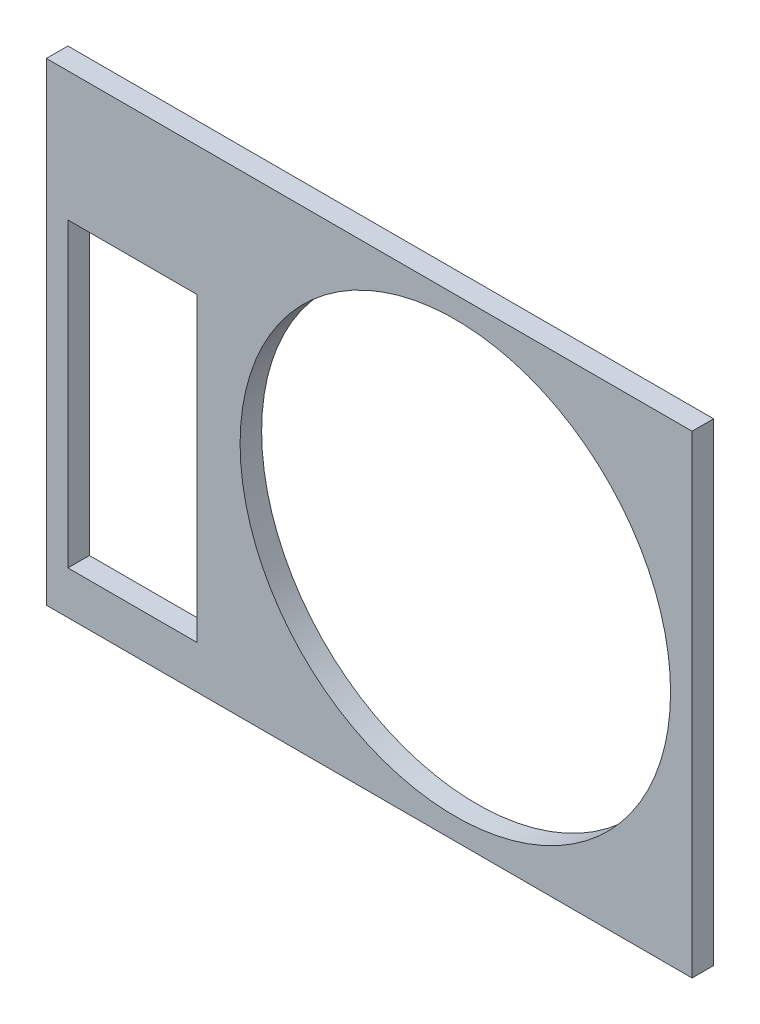
ISO-10303-21;
HEADER;
FILE_DESCRIPTION(('STEP AP214'),'2;1');
FILE_NAME('part.step','',(''),(''),'','','');
FILE_SCHEMA(('AUTOMOTIVE_DESIGN { 1 0 10303 214 1 1 1 1 }'));
ENDSEC;
DATA;
#1=APPLICATION_CONTEXT('core data for automotive mechanical design processes');
#2=APPLICATION_PROTOCOL_DEFINITION('international standard','automotive_design',2000,#1);
#3=PRODUCT_CONTEXT('',#1,'mechanical');
#4=PRODUCT('Part','Part','',(#3));
#5=PRODUCT_RELATED_PRODUCT_CATEGORY('part','',(#4));
#6=PRODUCT_DEFINITION_FORMATION('','',#4);
#7=PRODUCT_DEFINITION_CONTEXT('part definition',#1,'design');
#8=PRODUCT_DEFINITION('design','',#6,#7);
#9=PRODUCT_DEFINITION_SHAPE('','',#8);
#10=(LENGTH_UNIT() NAMED_UNIT(*) SI_UNIT(.MILLI.,.METRE.));
#11=(NAMED_UNIT(*) PLANE_ANGLE_UNIT() SI_UNIT($,.RADIAN.));
#12=(NAMED_UNIT(*) SI_UNIT($,.STERADIAN.) SOLID_ANGLE_UNIT());
#13=UNCERTAINTY_MEASURE_WITH_UNIT(LENGTH_MEASURE(1.E-05),#10,'distance_accuracy_value','');
#14=(GEOMETRIC_REPRESENTATION_CONTEXT(3) GLOBAL_UNCERTAINTY_ASSIGNED_CONTEXT((#13)) GLOBAL_UNIT_ASSIGNED_CONTEXT((#10,
#11,#12)) REPRESENTATION_CONTEXT('',''));
#15=CARTESIAN_POINT('',(0.,0.,0.));
#16=DIRECTION('',(0.,0.,1.));
#17=DIRECTION('',(1.,0.,0.));
#18=AXIS2_PLACEMENT_3D('',#15,#16,#17);
#19=CARTESIAN_POINT('',(0.,0.,10.));
#20=DIRECTION('',(0.,0.,-1.));
#21=DIRECTION('',(-1.,0.,0.));
#22=AXIS2_PLACEMENT_3D('',#19,#20,#21);
#23=PLANE('',#22);
#24=DIRECTION('',(-1.,0.,0.));
#25=VECTOR('',#24,1.);
#26=CARTESIAN_POINT('',(70.,160.,10.));
#27=LINE('',#26,#25);
#28=CARTESIAN_POINT('',(70.,160.,10.));
#29=VERTEX_POINT('',#28);
#30=CARTESIAN_POINT('',(10.,160.,10.));
#31=VERTEX_POINT('',#30);
#32=EDGE_CURVE('E136',#29,#31,#27,.T.);
#33=ORIENTED_EDGE('',*,*,#32,.F.);
#34=DIRECTION('',(0.,1.,0.));
#35=VECTOR('',#34,1.);
#36=CARTESIAN_POINT('',(70.,20.,10.));
#37=LINE('',#36,#35);
#38=CARTESIAN_POINT('',(70.,20.,10.));
#39=VERTEX_POINT('',#38);
#40=EDGE_CURVE('E59',#39,#29,#37,.T.);
#41=ORIENTED_EDGE('',*,*,#40,.F.);
#42=DIRECTION('',(1.,0.,0.));
#43=VECTOR('',#42,1.);
#44=CARTESIAN_POINT('',(70.,20.,10.));
#45=LINE('',#44,#43);
#46=CARTESIAN_POINT('',(10.,20.,10.));
#47=VERTEX_POINT('',#46);
#48=EDGE_CURVE('E127',#47,#39,#45,.T.);
#49=ORIENTED_EDGE('',*,*,#48,.F.);
#50=DIRECTION('',(0.,-1.,0.));
#51=VECTOR('',#50,1.);
#52=CARTESIAN_POINT('',(10.,20.,10.));
#53=LINE('',#52,#51);
#54=EDGE_CURVE('E130',#31,#47,#53,.T.);
#55=ORIENTED_EDGE('',*,*,#54,.F.);
#56=EDGE_LOOP('',(#33,#41,#49,#55));
#57=FACE_BOUND('',#56,.T.);
#58=DIRECTION('',(0.,-1.,0.));
#59=VECTOR('',#58,1.);
#60=CARTESIAN_POINT('',(0.,0.,10.));
#61=LINE('',#60,#59);
#62=CARTESIAN_POINT('',(0.,220.,10.));
#63=VERTEX_POINT('',#62);
#64=CARTESIAN_POINT('',(0.,0.,10.));
#65=VERTEX_POINT('',#64);
#66=EDGE_CURVE('E152',#63,#65,#61,.T.);
#67=ORIENTED_EDGE('',*,*,#66,.T.);
#68=DIRECTION('',(1.,0.,0.));
#69=VECTOR('',#68,1.);
#70=CARTESIAN_POINT('',(0.,0.,10.));
#71=LINE('',#70,#69);
#72=CARTESIAN_POINT('',(300.,0.,10.));
#73=VERTEX_POINT('',#72);
#74=EDGE_CURVE('E155',#65,#73,#71,.T.);
#75=ORIENTED_EDGE('',*,*,#74,.T.);
#76=DIRECTION('',(0.,1.,0.));
#77=VECTOR('',#76,1.);
#78=CARTESIAN_POINT('',(300.,0.,10.));
#79=LINE('',#78,#77);
#80=CARTESIAN_POINT('',(300.,220.,10.));
#81=VERTEX_POINT('',#80);
#82=EDGE_CURVE('E158',#73,#81,#79,.T.);
#83=ORIENTED_EDGE('',*,*,#82,.T.);
#84=DIRECTION('',(-1.,0.,0.));
#85=VECTOR('',#84,1.);
#86=CARTESIAN_POINT('',(0.,220.,10.));
#87=LINE('',#86,#85);
#88=EDGE_CURVE('E160',#81,#63,#87,.T.);
#89=ORIENTED_EDGE('',*,*,#88,.T.);
#90=EDGE_LOOP('',(#67,#75,#83,#89));
#91=FACE_BOUND('',#90,.T.);
#92=CARTESIAN_POINT('',(190.,110.,10.));
#93=DIRECTION('',(0.,0.,1.));
#94=DIRECTION('',(1.,0.,0.));
#95=AXIS2_PLACEMENT_3D('',#92,#93,#94);
#96=CIRCLE('',#95,100.);
#97=CARTESIAN_POINT('',(290.,110.,10.));
#98=VERTEX_POINT('',#97);
#99=EDGE_CURVE('E146',#98,#98,#96,.T.);
#100=ORIENTED_EDGE('',*,*,#99,.F.);
#101=EDGE_LOOP('',(#100));
#102=FACE_BOUND('',#101,.T.);
#103=ADVANCED_FACE('F44',(#57,#91,#102),#23,.F.);
#104=CARTESIAN_POINT('',(0.,0.,0.));
#105=DIRECTION('',(0.,0.,-1.));
#106=DIRECTION('',(-1.,0.,0.));
#107=AXIS2_PLACEMENT_3D('',#104,#105,#106);
#108=PLANE('',#107);
#109=DIRECTION('',(0.,1.,0.));
#110=VECTOR('',#109,1.);
#111=CARTESIAN_POINT('',(70.,20.,0.));
#112=LINE('',#111,#110);
#113=CARTESIAN_POINT('',(70.,20.,0.));
#114=VERTEX_POINT('',#113);
#115=CARTESIAN_POINT('',(70.,160.,0.));
#116=VERTEX_POINT('',#115);
#117=EDGE_CURVE('E111',#114,#116,#112,.T.);
#118=ORIENTED_EDGE('',*,*,#117,.T.);
#119=DIRECTION('',(-1.,0.,0.));
#120=VECTOR('',#119,1.);
#121=CARTESIAN_POINT('',(70.,160.,0.));
#122=LINE('',#121,#120);
#123=CARTESIAN_POINT('',(10.,160.,0.));
#124=VERTEX_POINT('',#123);
#125=EDGE_CURVE('E120',#116,#124,#122,.T.);
#126=ORIENTED_EDGE('',*,*,#125,.T.);
#127=DIRECTION('',(0.,-1.,0.));
#128=VECTOR('',#127,1.);
#129=CARTESIAN_POINT('',(10.,20.,0.));
#130=LINE('',#129,#128);
#131=CARTESIAN_POINT('',(10.,20.,0.));
#132=VERTEX_POINT('',#131);
#133=EDGE_CURVE('E67',#124,#132,#130,.T.);
#134=ORIENTED_EDGE('',*,*,#133,.T.);
#135=DIRECTION('',(1.,0.,0.));
#136=VECTOR('',#135,1.);
#137=CARTESIAN_POINT('',(70.,20.,0.));
#138=LINE('',#137,#136);
#139=EDGE_CURVE('E117',#132,#114,#138,.T.);
#140=ORIENTED_EDGE('',*,*,#139,.T.);
#141=EDGE_LOOP('',(#118,#126,#134,#140));
#142=FACE_BOUND('',#141,.T.);
#143=DIRECTION('',(0.,-1.,0.));
#144=VECTOR('',#143,1.);
#145=CARTESIAN_POINT('',(0.,0.,0.));
#146=LINE('',#145,#144);
#147=CARTESIAN_POINT('',(0.,220.,0.));
#148=VERTEX_POINT('',#147);
#149=CARTESIAN_POINT('',(0.,0.,0.));
#150=VERTEX_POINT('',#149);
#151=EDGE_CURVE('E149',#148,#150,#146,.T.);
#152=ORIENTED_EDGE('',*,*,#151,.F.);
#153=DIRECTION('',(-1.,0.,0.));
#154=VECTOR('',#153,1.);
#155=CARTESIAN_POINT('',(0.,220.,0.));
#156=LINE('',#155,#154);
#157=CARTESIAN_POINT('',(300.,220.,0.));
#158=VERTEX_POINT('',#157);
#159=EDGE_CURVE('E156',#158,#148,#156,.T.);
#160=ORIENTED_EDGE('',*,*,#159,.F.);
#161=DIRECTION('',(0.,1.,0.));
#162=VECTOR('',#161,1.);
#163=CARTESIAN_POINT('',(300.,0.,0.));
#164=LINE('',#163,#162);
#165=CARTESIAN_POINT('',(300.,0.,0.));
#166=VERTEX_POINT('',#165);
#167=EDGE_CURVE('E167',#166,#158,#164,.T.);
#168=ORIENTED_EDGE('',*,*,#167,.F.);
#169=DIRECTION('',(1.,0.,0.));
#170=VECTOR('',#169,1.);
#171=CARTESIAN_POINT('',(0.,0.,0.));
#172=LINE('',#171,#170);
#173=EDGE_CURVE('E165',#150,#166,#172,.T.);
#174=ORIENTED_EDGE('',*,*,#173,.F.);
#175=EDGE_LOOP('',(#152,#160,#168,#174));
#176=FACE_BOUND('',#175,.T.);
#177=CARTESIAN_POINT('',(190.,110.,0.));
#178=DIRECTION('',(0.,0.,1.));
#179=DIRECTION('',(1.,0.,0.));
#180=AXIS2_PLACEMENT_3D('',#177,#178,#179);
#181=CIRCLE('',#180,100.);
#182=CARTESIAN_POINT('',(290.,110.,0.));
#183=VERTEX_POINT('',#182);
#184=EDGE_CURVE('E142',#183,#183,#181,.T.);
#185=ORIENTED_EDGE('',*,*,#184,.T.);
#186=EDGE_LOOP('',(#185));
#187=FACE_BOUND('',#186,.T.);
#188=ADVANCED_FACE('F124',(#142,#176,#187),#108,.T.);
#189=CARTESIAN_POINT('',(0.,0.,10.));
#190=DIRECTION('',(1.,0.,0.));
#191=DIRECTION('',(0.,0.,-1.));
#192=AXIS2_PLACEMENT_3D('',#189,#190,#191);
#193=PLANE('',#192);
#194=ORIENTED_EDGE('',*,*,#151,.T.);
#195=DIRECTION('',(0.,0.,-1.));
#196=VECTOR('',#195,1.);
#197=CARTESIAN_POINT('',(0.,0.,10.));
#198=LINE('',#197,#196);
#199=EDGE_CURVE('E11',#65,#150,#198,.T.);
#200=ORIENTED_EDGE('',*,*,#199,.F.);
#201=ORIENTED_EDGE('',*,*,#66,.F.);
#202=DIRECTION('',(0.,0.,-1.));
#203=VECTOR('',#202,1.);
#204=CARTESIAN_POINT('',(0.,220.,10.));
#205=LINE('',#204,#203);
#206=EDGE_CURVE('E162',#63,#148,#205,.T.);
#207=ORIENTED_EDGE('',*,*,#206,.T.);
#208=EDGE_LOOP('',(#194,#200,#201,#207));
#209=FACE_BOUND('',#208,.T.);
#210=ADVANCED_FACE('F46',(#209),#193,.F.);
#211=CARTESIAN_POINT('',(0.,0.,10.));
#212=DIRECTION('',(0.,1.,0.));
#213=DIRECTION('',(0.,0.,1.));
#214=AXIS2_PLACEMENT_3D('',#211,#212,#213);
#215=PLANE('',#214);
#216=ORIENTED_EDGE('',*,*,#173,.T.);
#217=DIRECTION('',(0.,0.,-1.));
#218=VECTOR('',#217,1.);
#219=CARTESIAN_POINT('',(300.,0.,10.));
#220=LINE('',#219,#218);
#221=EDGE_CURVE('E52',#73,#166,#220,.T.);
#222=ORIENTED_EDGE('',*,*,#221,.F.);
#223=ORIENTED_EDGE('',*,*,#74,.F.);
#224=ORIENTED_EDGE('',*,*,#199,.T.);
#225=EDGE_LOOP('',(#216,#222,#223,#224));
#226=FACE_BOUND('',#225,.T.);
#227=ADVANCED_FACE('F194',(#226),#215,.F.);
#228=CARTESIAN_POINT('',(300.,0.,10.));
#229=DIRECTION('',(-1.,0.,0.));
#230=DIRECTION('',(0.,0.,1.));
#231=AXIS2_PLACEMENT_3D('',#228,#229,#230);
#232=PLANE('',#231);
#233=ORIENTED_EDGE('',*,*,#167,.T.);
#234=DIRECTION('',(0.,0.,-1.));
#235=VECTOR('',#234,1.);
#236=CARTESIAN_POINT('',(300.,220.,10.));
#237=LINE('',#236,#235);
#238=EDGE_CURVE('E172',#81,#158,#237,.T.);
#239=ORIENTED_EDGE('',*,*,#238,.F.);
#240=ORIENTED_EDGE('',*,*,#82,.F.);
#241=ORIENTED_EDGE('',*,*,#221,.T.);
#242=EDGE_LOOP('',(#233,#239,#240,#241));
#243=FACE_BOUND('',#242,.T.);
#244=ADVANCED_FACE('F179',(#243),#232,.F.);
#245=CARTESIAN_POINT('',(0.,220.,10.));
#246=DIRECTION('',(0.,-1.,0.));
#247=DIRECTION('',(0.,0.,-1.));
#248=AXIS2_PLACEMENT_3D('',#245,#246,#247);
#249=PLANE('',#248);
#250=ORIENTED_EDGE('',*,*,#159,.T.);
#251=ORIENTED_EDGE('',*,*,#206,.F.);
#252=ORIENTED_EDGE('',*,*,#88,.F.);
#253=ORIENTED_EDGE('',*,*,#238,.T.);
#254=EDGE_LOOP('',(#250,#251,#252,#253));
#255=FACE_BOUND('',#254,.T.);
#256=ADVANCED_FACE('F187',(#255),#249,.F.);
#257=CARTESIAN_POINT('',(190.,110.,10.));
#258=DIRECTION('',(0.,0.,-1.));
#259=DIRECTION('',(-1.,0.,0.));
#260=AXIS2_PLACEMENT_3D('',#257,#258,#259);
#261=CYLINDRICAL_SURFACE('',#260,100.);
#262=ORIENTED_EDGE('',*,*,#99,.T.);
#263=EDGE_LOOP('',(#262));
#264=FACE_BOUND('',#263,.T.);
#265=ORIENTED_EDGE('',*,*,#184,.F.);
#266=EDGE_LOOP('',(#265));
#267=FACE_BOUND('',#266,.T.);
#268=ADVANCED_FACE('F210',(#264,#267),#261,.F.);
#269=CARTESIAN_POINT('',(70.,20.,0.));
#270=DIRECTION('',(1.,0.,0.));
#271=DIRECTION('',(0.,0.,-1.));
#272=AXIS2_PLACEMENT_3D('',#269,#270,#271);
#273=PLANE('',#272);
#274=ORIENTED_EDGE('',*,*,#40,.T.);
#275=DIRECTION('',(0.,0.,1.));
#276=VECTOR('',#275,1.);
#277=CARTESIAN_POINT('',(70.,160.,0.));
#278=LINE('',#277,#276);
#279=EDGE_CURVE('E107',#116,#29,#278,.T.);
#280=ORIENTED_EDGE('',*,*,#279,.F.);
#281=ORIENTED_EDGE('',*,*,#117,.F.);
#282=DIRECTION('',(0.,0.,1.));
#283=VECTOR('',#282,1.);
#284=CARTESIAN_POINT('',(70.,20.,0.));
#285=LINE('',#284,#283);
#286=EDGE_CURVE('E140',#114,#39,#285,.T.);
#287=ORIENTED_EDGE('',*,*,#286,.T.);
#288=EDGE_LOOP('',(#274,#280,#281,#287));
#289=FACE_BOUND('',#288,.T.);
#290=ADVANCED_FACE('F109',(#289),#273,.F.);
#291=CARTESIAN_POINT('',(70.,20.,0.));
#292=DIRECTION('',(0.,-1.,0.));
#293=DIRECTION('',(1.,0.,0.));
#294=AXIS2_PLACEMENT_3D('',#291,#292,#293);
#295=PLANE('',#294);
#296=ORIENTED_EDGE('',*,*,#48,.T.);
#297=ORIENTED_EDGE('',*,*,#286,.F.);
#298=ORIENTED_EDGE('',*,*,#139,.F.);
#299=DIRECTION('',(0.,0.,1.));
#300=VECTOR('',#299,1.);
#301=CARTESIAN_POINT('',(10.,20.,0.));
#302=LINE('',#301,#300);
#303=EDGE_CURVE('E143',#132,#47,#302,.T.);
#304=ORIENTED_EDGE('',*,*,#303,.T.);
#305=EDGE_LOOP('',(#296,#297,#298,#304));
#306=FACE_BOUND('',#305,.T.);
#307=ADVANCED_FACE('F220',(#306),#295,.F.);
#308=CARTESIAN_POINT('',(10.,20.,0.));
#309=DIRECTION('',(-1.,0.,0.));
#310=DIRECTION('',(0.,-1.,0.));
#311=AXIS2_PLACEMENT_3D('',#308,#309,#310);
#312=PLANE('',#311);
#313=ORIENTED_EDGE('',*,*,#54,.T.);
#314=ORIENTED_EDGE('',*,*,#303,.F.);
#315=ORIENTED_EDGE('',*,*,#133,.F.);
#316=DIRECTION('',(0.,0.,1.));
#317=VECTOR('',#316,1.);
#318=CARTESIAN_POINT('',(10.,160.,0.));
#319=LINE('',#318,#317);
#320=EDGE_CURVE('E116',#124,#31,#319,.T.);
#321=ORIENTED_EDGE('',*,*,#320,.T.);
#322=EDGE_LOOP('',(#313,#314,#315,#321));
#323=FACE_BOUND('',#322,.T.);
#324=ADVANCED_FACE('F227',(#323),#312,.F.);
#325=CARTESIAN_POINT('',(70.,160.,0.));
#326=DIRECTION('',(0.,1.,0.));
#327=DIRECTION('',(0.,0.,1.));
#328=AXIS2_PLACEMENT_3D('',#325,#326,#327);
#329=PLANE('',#328);
#330=ORIENTED_EDGE('',*,*,#32,.T.);
#331=ORIENTED_EDGE('',*,*,#320,.F.);
#332=ORIENTED_EDGE('',*,*,#125,.F.);
#333=ORIENTED_EDGE('',*,*,#279,.T.);
#334=EDGE_LOOP('',(#330,#331,#332,#333));
#335=FACE_BOUND('',#334,.T.);
#336=ADVANCED_FACE('F121',(#335),#329,.F.);
#337=CLOSED_SHELL('',(#103,#188,#210,#227,#244,#256,#268,#290,#307,#324,#336));
#338=MANIFOLD_SOLID_BREP('B2',#337);
#339=ADVANCED_BREP_SHAPE_REPRESENTATION('',(#18,#338),#14);
#340=SHAPE_DEFINITION_REPRESENTATION(#9,#339);
ENDSEC;
END-ISO-10303-21;
